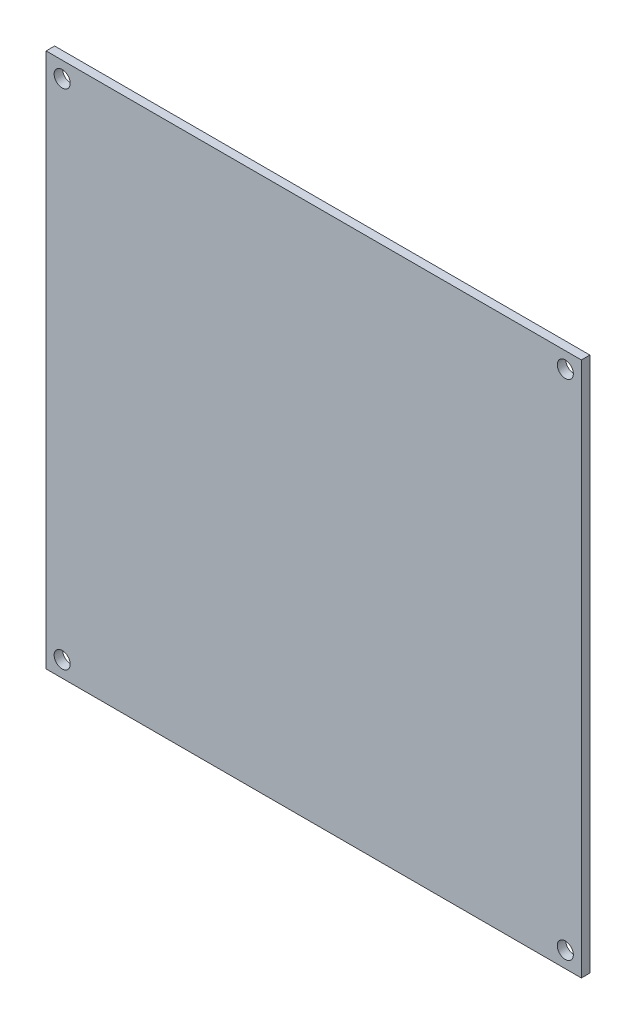
ISO-10303-21;
HEADER;
FILE_DESCRIPTION(('STEP AP214'),'2;1');
FILE_NAME('part.step','',(''),(''),'','','');
FILE_SCHEMA(('AUTOMOTIVE_DESIGN { 1 0 10303 214 1 1 1 1 }'));
ENDSEC;
DATA;
#1=APPLICATION_CONTEXT('core data for automotive mechanical design processes');
#2=APPLICATION_PROTOCOL_DEFINITION('international standard','automotive_design',2000,#1);
#3=PRODUCT_CONTEXT('',#1,'mechanical');
#4=PRODUCT('Part','Part','',(#3));
#5=PRODUCT_RELATED_PRODUCT_CATEGORY('part','',(#4));
#6=PRODUCT_DEFINITION_FORMATION('','',#4);
#7=PRODUCT_DEFINITION_CONTEXT('part definition',#1,'design');
#8=PRODUCT_DEFINITION('design','',#6,#7);
#9=PRODUCT_DEFINITION_SHAPE('','',#8);
#10=(LENGTH_UNIT() NAMED_UNIT(*) SI_UNIT(.MILLI.,.METRE.));
#11=(NAMED_UNIT(*) PLANE_ANGLE_UNIT() SI_UNIT($,.RADIAN.));
#12=(NAMED_UNIT(*) SI_UNIT($,.STERADIAN.) SOLID_ANGLE_UNIT());
#13=UNCERTAINTY_MEASURE_WITH_UNIT(LENGTH_MEASURE(1.E-05),#10,'distance_accuracy_value','');
#14=(GEOMETRIC_REPRESENTATION_CONTEXT(3) GLOBAL_UNCERTAINTY_ASSIGNED_CONTEXT((#13)) GLOBAL_UNIT_ASSIGNED_CONTEXT((#10,
#11,#12)) REPRESENTATION_CONTEXT('',''));
#15=CARTESIAN_POINT('',(0.,0.,0.));
#16=DIRECTION('',(0.,0.,1.));
#17=DIRECTION('',(1.,0.,0.));
#18=AXIS2_PLACEMENT_3D('',#15,#16,#17);
#19=CARTESIAN_POINT('',(0.,0.,-1.59143954));
#20=DIRECTION('',(0.,1.,0.));
#21=DIRECTION('',(1.,0.,0.));
#22=AXIS2_PLACEMENT_3D('',#19,#20,#21);
#23=PLANE('',#22);
#24=DIRECTION('',(1.,0.,0.));
#25=VECTOR('',#24,1.);
#26=CARTESIAN_POINT('',(0.,0.,0.));
#27=LINE('',#26,#25);
#28=CARTESIAN_POINT('',(0.,0.,0.));
#29=VERTEX_POINT('',#28);
#30=CARTESIAN_POINT('',(100.,0.,0.));
#31=VERTEX_POINT('',#30);
#32=EDGE_CURVE('E11',#29,#31,#27,.T.);
#33=ORIENTED_EDGE('',*,*,#32,.F.);
#34=DIRECTION('',(0.,0.,1.));
#35=VECTOR('',#34,1.);
#36=CARTESIAN_POINT('',(0.,0.,-1.59143954));
#37=LINE('',#36,#35);
#38=CARTESIAN_POINT('',(0.,0.,-1.59143954));
#39=VERTEX_POINT('',#38);
#40=EDGE_CURVE('E23',#39,#29,#37,.T.);
#41=ORIENTED_EDGE('',*,*,#40,.F.);
#42=DIRECTION('',(1.,0.,0.));
#43=VECTOR('',#42,1.);
#44=CARTESIAN_POINT('',(0.,0.,-1.59143954));
#45=LINE('',#44,#43);
#46=CARTESIAN_POINT('',(100.,0.,-1.59143954));
#47=VERTEX_POINT('',#46);
#48=EDGE_CURVE('E142',#39,#47,#45,.T.);
#49=ORIENTED_EDGE('',*,*,#48,.T.);
#50=DIRECTION('',(0.,0.,1.));
#51=VECTOR('',#50,1.);
#52=CARTESIAN_POINT('',(100.,0.,-1.59143954));
#53=LINE('',#52,#51);
#54=EDGE_CURVE('E36',#47,#31,#53,.T.);
#55=ORIENTED_EDGE('',*,*,#54,.T.);
#56=EDGE_LOOP('',(#33,#41,#49,#55));
#57=FACE_BOUND('',#56,.T.);
#58=ADVANCED_FACE('F16',(#57),#23,.F.);
#59=CARTESIAN_POINT('',(100.,0.,-1.59143954));
#60=DIRECTION('',(-1.,0.,0.));
#61=DIRECTION('',(0.,1.,0.));
#62=AXIS2_PLACEMENT_3D('',#59,#60,#61);
#63=PLANE('',#62);
#64=DIRECTION('',(0.,1.,0.));
#65=VECTOR('',#64,1.);
#66=CARTESIAN_POINT('',(100.,0.,0.));
#67=LINE('',#66,#65);
#68=CARTESIAN_POINT('',(100.,100.,0.));
#69=VERTEX_POINT('',#68);
#70=EDGE_CURVE('E138',#31,#69,#67,.T.);
#71=ORIENTED_EDGE('',*,*,#70,.F.);
#72=ORIENTED_EDGE('',*,*,#54,.F.);
#73=DIRECTION('',(0.,1.,0.));
#74=VECTOR('',#73,1.);
#75=CARTESIAN_POINT('',(100.,0.,-1.59143954));
#76=LINE('',#75,#74);
#77=CARTESIAN_POINT('',(100.,100.,-1.59143954));
#78=VERTEX_POINT('',#77);
#79=EDGE_CURVE('E135',#47,#78,#76,.T.);
#80=ORIENTED_EDGE('',*,*,#79,.T.);
#81=DIRECTION('',(0.,0.,1.));
#82=VECTOR('',#81,1.);
#83=CARTESIAN_POINT('',(100.,100.,-1.59143954));
#84=LINE('',#83,#82);
#85=EDGE_CURVE('E133',#78,#69,#84,.T.);
#86=ORIENTED_EDGE('',*,*,#85,.T.);
#87=EDGE_LOOP('',(#71,#72,#80,#86));
#88=FACE_BOUND('',#87,.T.);
#89=ADVANCED_FACE('F151',(#88),#63,.F.);
#90=CARTESIAN_POINT('',(100.,100.,-1.59143954));
#91=DIRECTION('',(0.,-1.,0.));
#92=DIRECTION('',(-1.,0.,0.));
#93=AXIS2_PLACEMENT_3D('',#90,#91,#92);
#94=PLANE('',#93);
#95=DIRECTION('',(-1.,0.,0.));
#96=VECTOR('',#95,1.);
#97=CARTESIAN_POINT('',(100.,100.,0.));
#98=LINE('',#97,#96);
#99=CARTESIAN_POINT('',(0.,100.,0.));
#100=VERTEX_POINT('',#99);
#101=EDGE_CURVE('E130',#69,#100,#98,.T.);
#102=ORIENTED_EDGE('',*,*,#101,.F.);
#103=ORIENTED_EDGE('',*,*,#85,.F.);
#104=DIRECTION('',(-1.,0.,0.));
#105=VECTOR('',#104,1.);
#106=CARTESIAN_POINT('',(100.,100.,-1.59143954));
#107=LINE('',#106,#105);
#108=CARTESIAN_POINT('',(0.,100.,-1.59143954));
#109=VERTEX_POINT('',#108);
#110=EDGE_CURVE('E127',#78,#109,#107,.T.);
#111=ORIENTED_EDGE('',*,*,#110,.T.);
#112=DIRECTION('',(0.,0.,1.));
#113=VECTOR('',#112,1.);
#114=CARTESIAN_POINT('',(0.,100.,-1.59143954));
#115=LINE('',#114,#113);
#116=EDGE_CURVE('E125',#109,#100,#115,.T.);
#117=ORIENTED_EDGE('',*,*,#116,.T.);
#118=EDGE_LOOP('',(#102,#103,#111,#117));
#119=FACE_BOUND('',#118,.T.);
#120=ADVANCED_FACE('F157',(#119),#94,.F.);
#121=CARTESIAN_POINT('',(0.,100.,-1.59143954));
#122=DIRECTION('',(1.,0.,0.));
#123=DIRECTION('',(0.,-1.,0.));
#124=AXIS2_PLACEMENT_3D('',#121,#122,#123);
#125=PLANE('',#124);
#126=DIRECTION('',(0.,-1.,0.));
#127=VECTOR('',#126,1.);
#128=CARTESIAN_POINT('',(0.,100.,0.));
#129=LINE('',#128,#127);
#130=EDGE_CURVE('E122',#100,#29,#129,.T.);
#131=ORIENTED_EDGE('',*,*,#130,.F.);
#132=ORIENTED_EDGE('',*,*,#116,.F.);
#133=DIRECTION('',(0.,-1.,0.));
#134=VECTOR('',#133,1.);
#135=CARTESIAN_POINT('',(0.,100.,-1.59143954));
#136=LINE('',#135,#134);
#137=EDGE_CURVE('E120',#109,#39,#136,.T.);
#138=ORIENTED_EDGE('',*,*,#137,.T.);
#139=ORIENTED_EDGE('',*,*,#40,.T.);
#140=EDGE_LOOP('',(#131,#132,#138,#139));
#141=FACE_BOUND('',#140,.T.);
#142=ADVANCED_FACE('F158',(#141),#125,.F.);
#143=CARTESIAN_POINT('',(2.99999908,2.99999908,-1.59143954));
#144=DIRECTION('',(0.,0.,-1.));
#145=DIRECTION('',(1.,0.,0.));
#146=AXIS2_PLACEMENT_3D('',#143,#144,#145);
#147=CYLINDRICAL_SURFACE('',#146,1.49999954);
#148=DIRECTION('',(0.,0.,1.));
#149=VECTOR('',#148,1.);
#150=CARTESIAN_POINT('',(4.49999862,2.99999908,-1.59143954));
#151=LINE('',#150,#149);
#152=CARTESIAN_POINT('',(4.49999862,2.99999908,-1.59143954));
#153=VERTEX_POINT('',#152);
#154=CARTESIAN_POINT('',(4.49999862,2.99999908,0.));
#155=VERTEX_POINT('',#154);
#156=EDGE_CURVE('E118',#153,#155,#151,.T.);
#157=ORIENTED_EDGE('',*,*,#156,.T.);
#158=CARTESIAN_POINT('',(2.99999908,2.99999908,0.));
#159=DIRECTION('',(0.,0.,1.));
#160=DIRECTION('',(1.,0.,0.));
#161=AXIS2_PLACEMENT_3D('',#158,#159,#160);
#162=CIRCLE('',#161,1.49999954);
#163=EDGE_CURVE('E115',#155,#155,#162,.T.);
#164=ORIENTED_EDGE('',*,*,#163,.T.);
#165=ORIENTED_EDGE('',*,*,#156,.F.);
#166=CARTESIAN_POINT('',(2.99999908,2.99999908,-1.59143954));
#167=DIRECTION('',(0.,0.,1.));
#168=DIRECTION('',(1.,0.,0.));
#169=AXIS2_PLACEMENT_3D('',#166,#167,#168);
#170=CIRCLE('',#169,1.49999954);
#171=EDGE_CURVE('E111',#153,#153,#170,.T.);
#172=ORIENTED_EDGE('',*,*,#171,.F.);
#173=EDGE_LOOP('',(#157,#164,#165,#172));
#174=FACE_BOUND('',#173,.T.);
#175=ADVANCED_FACE('F160',(#174),#147,.F.);
#176=CARTESIAN_POINT('',(2.99999908,96.99999904,-1.59143954));
#177=DIRECTION('',(0.,0.,-1.));
#178=DIRECTION('',(1.,0.,0.));
#179=AXIS2_PLACEMENT_3D('',#176,#177,#178);
#180=CYLINDRICAL_SURFACE('',#179,1.49999954);
#181=DIRECTION('',(0.,0.,1.));
#182=VECTOR('',#181,1.);
#183=CARTESIAN_POINT('',(4.49999862,96.99999904,-1.59143954));
#184=LINE('',#183,#182);
#185=CARTESIAN_POINT('',(4.49999862,96.99999904,-1.59143954));
#186=VERTEX_POINT('',#185);
#187=CARTESIAN_POINT('',(4.49999862,96.99999904,0.));
#188=VERTEX_POINT('',#187);
#189=EDGE_CURVE('E109',#186,#188,#184,.T.);
#190=ORIENTED_EDGE('',*,*,#189,.T.);
#191=CARTESIAN_POINT('',(2.99999908,96.99999904,0.));
#192=DIRECTION('',(0.,0.,1.));
#193=DIRECTION('',(1.,0.,0.));
#194=AXIS2_PLACEMENT_3D('',#191,#192,#193);
#195=CIRCLE('',#194,1.49999954);
#196=EDGE_CURVE('E106',#188,#188,#195,.T.);
#197=ORIENTED_EDGE('',*,*,#196,.T.);
#198=ORIENTED_EDGE('',*,*,#189,.F.);
#199=CARTESIAN_POINT('',(2.99999908,96.99999904,-1.59143954));
#200=DIRECTION('',(0.,0.,1.));
#201=DIRECTION('',(1.,0.,0.));
#202=AXIS2_PLACEMENT_3D('',#199,#200,#201);
#203=CIRCLE('',#202,1.49999954);
#204=EDGE_CURVE('E103',#186,#186,#203,.T.);
#205=ORIENTED_EDGE('',*,*,#204,.F.);
#206=EDGE_LOOP('',(#190,#197,#198,#205));
#207=FACE_BOUND('',#206,.T.);
#208=ADVANCED_FACE('F167',(#207),#180,.F.);
#209=CARTESIAN_POINT('',(96.99999904,2.99999908,-1.59143954));
#210=DIRECTION('',(0.,0.,-1.));
#211=DIRECTION('',(1.,0.,0.));
#212=AXIS2_PLACEMENT_3D('',#209,#210,#211);
#213=CYLINDRICAL_SURFACE('',#212,1.49999954);
#214=DIRECTION('',(0.,0.,1.));
#215=VECTOR('',#214,1.);
#216=CARTESIAN_POINT('',(98.49999858,2.99999908,-1.59143954));
#217=LINE('',#216,#215);
#218=CARTESIAN_POINT('',(98.49999858,2.99999908,-1.59143954));
#219=VERTEX_POINT('',#218);
#220=CARTESIAN_POINT('',(98.49999858,2.99999908,0.));
#221=VERTEX_POINT('',#220);
#222=EDGE_CURVE('E101',#219,#221,#217,.T.);
#223=ORIENTED_EDGE('',*,*,#222,.T.);
#224=CARTESIAN_POINT('',(96.99999904,2.99999908,0.));
#225=DIRECTION('',(0.,0.,1.));
#226=DIRECTION('',(1.,0.,0.));
#227=AXIS2_PLACEMENT_3D('',#224,#225,#226);
#228=CIRCLE('',#227,1.49999954);
#229=EDGE_CURVE('E98',#221,#221,#228,.T.);
#230=ORIENTED_EDGE('',*,*,#229,.T.);
#231=ORIENTED_EDGE('',*,*,#222,.F.);
#232=CARTESIAN_POINT('',(96.99999904,2.99999908,-1.59143954));
#233=DIRECTION('',(0.,0.,1.));
#234=DIRECTION('',(1.,0.,0.));
#235=AXIS2_PLACEMENT_3D('',#232,#233,#234);
#236=CIRCLE('',#235,1.49999954);
#237=EDGE_CURVE('E85',#219,#219,#236,.T.);
#238=ORIENTED_EDGE('',*,*,#237,.F.);
#239=EDGE_LOOP('',(#223,#230,#231,#238));
#240=FACE_BOUND('',#239,.T.);
#241=ADVANCED_FACE('F205',(#240),#213,.F.);
#242=CARTESIAN_POINT('',(96.99999904,96.99999904,-1.59143954));
#243=DIRECTION('',(0.,0.,-1.));
#244=DIRECTION('',(1.,0.,0.));
#245=AXIS2_PLACEMENT_3D('',#242,#243,#244);
#246=CYLINDRICAL_SURFACE('',#245,1.49999954);
#247=DIRECTION('',(0.,0.,1.));
#248=VECTOR('',#247,1.);
#249=CARTESIAN_POINT('',(98.49999858,96.99999904,-1.59143954));
#250=LINE('',#249,#248);
#251=CARTESIAN_POINT('',(98.49999858,96.99999904,-1.59143954));
#252=VERTEX_POINT('',#251);
#253=CARTESIAN_POINT('',(98.49999858,96.99999904,0.));
#254=VERTEX_POINT('',#253);
#255=EDGE_CURVE('E79',#252,#254,#250,.T.);
#256=ORIENTED_EDGE('',*,*,#255,.T.);
#257=CARTESIAN_POINT('',(96.99999904,96.99999904,0.));
#258=DIRECTION('',(0.,0.,1.));
#259=DIRECTION('',(1.,0.,0.));
#260=AXIS2_PLACEMENT_3D('',#257,#258,#259);
#261=CIRCLE('',#260,1.49999954);
#262=EDGE_CURVE('E84',#254,#254,#261,.T.);
#263=ORIENTED_EDGE('',*,*,#262,.T.);
#264=ORIENTED_EDGE('',*,*,#255,.F.);
#265=CARTESIAN_POINT('',(96.99999904,96.99999904,-1.59143954));
#266=DIRECTION('',(0.,0.,1.));
#267=DIRECTION('',(1.,0.,0.));
#268=AXIS2_PLACEMENT_3D('',#265,#266,#267);
#269=CIRCLE('',#268,1.49999954);
#270=EDGE_CURVE('E82',#252,#252,#269,.T.);
#271=ORIENTED_EDGE('',*,*,#270,.F.);
#272=EDGE_LOOP('',(#256,#263,#264,#271));
#273=FACE_BOUND('',#272,.T.);
#274=ADVANCED_FACE('F81',(#273),#246,.F.);
#275=CARTESIAN_POINT('',(0.,0.,-1.59143954));
#276=DIRECTION('',(0.,0.,-1.));
#277=DIRECTION('',(-1.,0.,0.));
#278=AXIS2_PLACEMENT_3D('',#275,#276,#277);
#279=PLANE('',#278);
#280=ORIENTED_EDGE('',*,*,#137,.F.);
#281=ORIENTED_EDGE('',*,*,#110,.F.);
#282=ORIENTED_EDGE('',*,*,#79,.F.);
#283=ORIENTED_EDGE('',*,*,#48,.F.);
#284=EDGE_LOOP('',(#280,#281,#282,#283));
#285=FACE_BOUND('',#284,.T.);
#286=ORIENTED_EDGE('',*,*,#171,.T.);
#287=EDGE_LOOP('',(#286));
#288=FACE_BOUND('',#287,.T.);
#289=ORIENTED_EDGE('',*,*,#204,.T.);
#290=EDGE_LOOP('',(#289));
#291=FACE_BOUND('',#290,.T.);
#292=ORIENTED_EDGE('',*,*,#237,.T.);
#293=EDGE_LOOP('',(#292));
#294=FACE_BOUND('',#293,.T.);
#295=ORIENTED_EDGE('',*,*,#270,.T.);
#296=EDGE_LOOP('',(#295));
#297=FACE_BOUND('',#296,.T.);
#298=ADVANCED_FACE('F88',(#285,#288,#291,#294,#297),#279,.T.);
#299=CARTESIAN_POINT('',(0.,0.,0.));
#300=DIRECTION('',(0.,0.,-1.));
#301=DIRECTION('',(-1.,0.,0.));
#302=AXIS2_PLACEMENT_3D('',#299,#300,#301);
#303=PLANE('',#302);
#304=ORIENTED_EDGE('',*,*,#32,.T.);
#305=ORIENTED_EDGE('',*,*,#70,.T.);
#306=ORIENTED_EDGE('',*,*,#101,.T.);
#307=ORIENTED_EDGE('',*,*,#130,.T.);
#308=EDGE_LOOP('',(#304,#305,#306,#307));
#309=FACE_BOUND('',#308,.T.);
#310=ORIENTED_EDGE('',*,*,#163,.F.);
#311=EDGE_LOOP('',(#310));
#312=FACE_BOUND('',#311,.T.);
#313=ORIENTED_EDGE('',*,*,#196,.F.);
#314=EDGE_LOOP('',(#313));
#315=FACE_BOUND('',#314,.T.);
#316=ORIENTED_EDGE('',*,*,#229,.F.);
#317=EDGE_LOOP('',(#316));
#318=FACE_BOUND('',#317,.T.);
#319=ORIENTED_EDGE('',*,*,#262,.F.);
#320=EDGE_LOOP('',(#319));
#321=FACE_BOUND('',#320,.T.);
#322=ADVANCED_FACE('F154',(#309,#312,#315,#318,#321),#303,.F.);
#323=CLOSED_SHELL('',(#58,#89,#120,#142,#175,#208,#241,#274,#298,#322));
#324=MANIFOLD_SOLID_BREP('B1',#323);
#325=ADVANCED_BREP_SHAPE_REPRESENTATION('',(#18,#324),#14);
#326=SHAPE_DEFINITION_REPRESENTATION(#9,#325);
ENDSEC;
END-ISO-10303-21;
